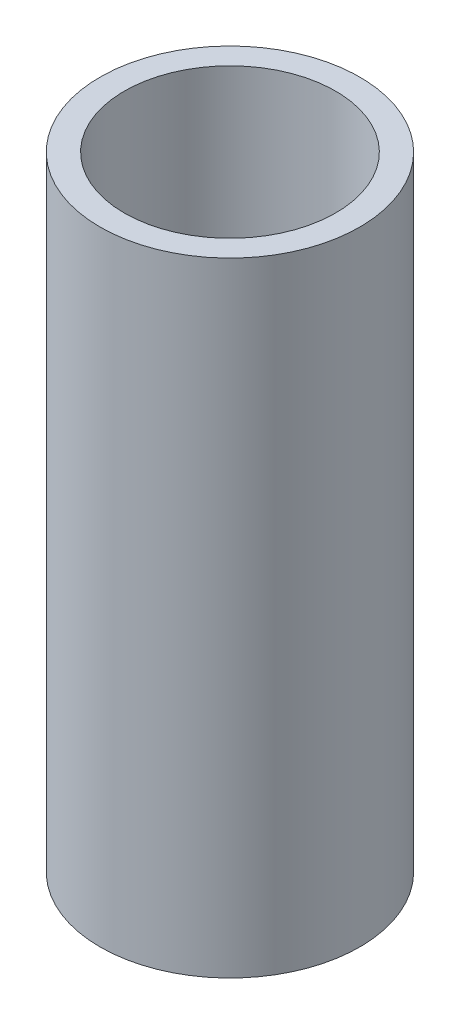
ISO-10303-21;
HEADER;
FILE_DESCRIPTION(('STEP AP214'),'2;1');
FILE_NAME('part.step','',(''),(''),'','','');
FILE_SCHEMA(('AUTOMOTIVE_DESIGN { 1 0 10303 214 1 1 1 1 }'));
ENDSEC;
DATA;
#1=APPLICATION_CONTEXT('core data for automotive mechanical design processes');
#2=APPLICATION_PROTOCOL_DEFINITION('international standard','automotive_design',2000,#1);
#3=PRODUCT_CONTEXT('',#1,'mechanical');
#4=PRODUCT('Part','Part','',(#3));
#5=PRODUCT_RELATED_PRODUCT_CATEGORY('part','',(#4));
#6=PRODUCT_DEFINITION_FORMATION('','',#4);
#7=PRODUCT_DEFINITION_CONTEXT('part definition',#1,'design');
#8=PRODUCT_DEFINITION('design','',#6,#7);
#9=PRODUCT_DEFINITION_SHAPE('','',#8);
#10=(LENGTH_UNIT() NAMED_UNIT(*) SI_UNIT(.MILLI.,.METRE.));
#11=(NAMED_UNIT(*) PLANE_ANGLE_UNIT() SI_UNIT($,.RADIAN.));
#12=(NAMED_UNIT(*) SI_UNIT($,.STERADIAN.) SOLID_ANGLE_UNIT());
#13=UNCERTAINTY_MEASURE_WITH_UNIT(LENGTH_MEASURE(1.E-05),#10,'distance_accuracy_value','');
#14=(GEOMETRIC_REPRESENTATION_CONTEXT(3) GLOBAL_UNCERTAINTY_ASSIGNED_CONTEXT((#13)) GLOBAL_UNIT_ASSIGNED_CONTEXT((#10,
#11,#12)) REPRESENTATION_CONTEXT('',''));
#15=CARTESIAN_POINT('',(0.,0.,0.));
#16=DIRECTION('',(0.,0.,1.));
#17=DIRECTION('',(1.,0.,0.));
#18=AXIS2_PLACEMENT_3D('',#15,#16,#17);
#19=CARTESIAN_POINT('',(0.,18.,0.));
#20=DIRECTION('',(0.,1.,0.));
#21=DIRECTION('',(0.,0.,1.));
#22=AXIS2_PLACEMENT_3D('',#19,#20,#21);
#23=PLANE('',#22);
#24=CARTESIAN_POINT('',(0.,18.,0.));
#25=DIRECTION('',(0.,1.,0.));
#26=DIRECTION('',(0.,0.,1.));
#27=AXIS2_PLACEMENT_3D('',#24,#25,#26);
#28=CIRCLE('',#27,3.75);
#29=CARTESIAN_POINT('',(0.,18.,3.75));
#30=VERTEX_POINT('',#29);
#31=EDGE_CURVE('E10',#30,#30,#28,.T.);
#32=ORIENTED_EDGE('',*,*,#31,.T.);
#33=EDGE_LOOP('',(#32));
#34=FACE_BOUND('',#33,.T.);
#35=CARTESIAN_POINT('',(0.,18.,0.));
#36=DIRECTION('',(0.,1.,0.));
#37=DIRECTION('',(0.,0.,1.));
#38=AXIS2_PLACEMENT_3D('',#35,#36,#37);
#39=CIRCLE('',#38,3.05);
#40=CARTESIAN_POINT('',(0.,18.,3.05));
#41=VERTEX_POINT('',#40);
#42=EDGE_CURVE('E42',#41,#41,#39,.T.);
#43=ORIENTED_EDGE('',*,*,#42,.F.);
#44=EDGE_LOOP('',(#43));
#45=FACE_BOUND('',#44,.T.);
#46=ADVANCED_FACE('F31',(#34,#45),#23,.T.);
#47=CARTESIAN_POINT('',(0.,0.,0.));
#48=DIRECTION('',(0.,1.,0.));
#49=DIRECTION('',(0.,0.,1.));
#50=AXIS2_PLACEMENT_3D('',#47,#48,#49);
#51=PLANE('',#50);
#52=CARTESIAN_POINT('',(0.,0.,0.));
#53=DIRECTION('',(0.,1.,0.));
#54=DIRECTION('',(0.,0.,1.));
#55=AXIS2_PLACEMENT_3D('',#52,#53,#54);
#56=CIRCLE('',#55,3.75);
#57=CARTESIAN_POINT('',(0.,0.,3.75));
#58=VERTEX_POINT('',#57);
#59=EDGE_CURVE('E35',#58,#58,#56,.T.);
#60=ORIENTED_EDGE('',*,*,#59,.F.);
#61=EDGE_LOOP('',(#60));
#62=FACE_BOUND('',#61,.T.);
#63=CARTESIAN_POINT('',(0.,0.,0.));
#64=DIRECTION('',(0.,1.,0.));
#65=DIRECTION('',(0.,0.,1.));
#66=AXIS2_PLACEMENT_3D('',#63,#64,#65);
#67=CIRCLE('',#66,3.05);
#68=CARTESIAN_POINT('',(0.,0.,3.05));
#69=VERTEX_POINT('',#68);
#70=EDGE_CURVE('E44',#69,#69,#67,.T.);
#71=ORIENTED_EDGE('',*,*,#70,.T.);
#72=EDGE_LOOP('',(#71));
#73=FACE_BOUND('',#72,.T.);
#74=ADVANCED_FACE('F54',(#62,#73),#51,.F.);
#75=CARTESIAN_POINT('',(0.,18.,0.));
#76=DIRECTION('',(0.,-1.,0.));
#77=DIRECTION('',(0.,0.,-1.));
#78=AXIS2_PLACEMENT_3D('',#75,#76,#77);
#79=CYLINDRICAL_SURFACE('',#78,3.75);
#80=ORIENTED_EDGE('',*,*,#31,.F.);
#81=EDGE_LOOP('',(#80));
#82=FACE_BOUND('',#81,.T.);
#83=ORIENTED_EDGE('',*,*,#59,.T.);
#84=EDGE_LOOP('',(#83));
#85=FACE_BOUND('',#84,.T.);
#86=ADVANCED_FACE('F33',(#82,#85),#79,.T.);
#87=CARTESIAN_POINT('',(0.,18.,0.));
#88=DIRECTION('',(0.,-1.,0.));
#89=DIRECTION('',(0.,0.,-1.));
#90=AXIS2_PLACEMENT_3D('',#87,#88,#89);
#91=CYLINDRICAL_SURFACE('',#90,3.05);
#92=ORIENTED_EDGE('',*,*,#42,.T.);
#93=EDGE_LOOP('',(#92));
#94=FACE_BOUND('',#93,.T.);
#95=ORIENTED_EDGE('',*,*,#70,.F.);
#96=EDGE_LOOP('',(#95));
#97=FACE_BOUND('',#96,.T.);
#98=ADVANCED_FACE('F50',(#94,#97),#91,.F.);
#99=CLOSED_SHELL('',(#46,#74,#86,#98));
#100=MANIFOLD_SOLID_BREP('B2',#99);
#101=ADVANCED_BREP_SHAPE_REPRESENTATION('',(#18,#100),#14);
#102=SHAPE_DEFINITION_REPRESENTATION(#9,#101);
ENDSEC;
END-ISO-10303-21;
